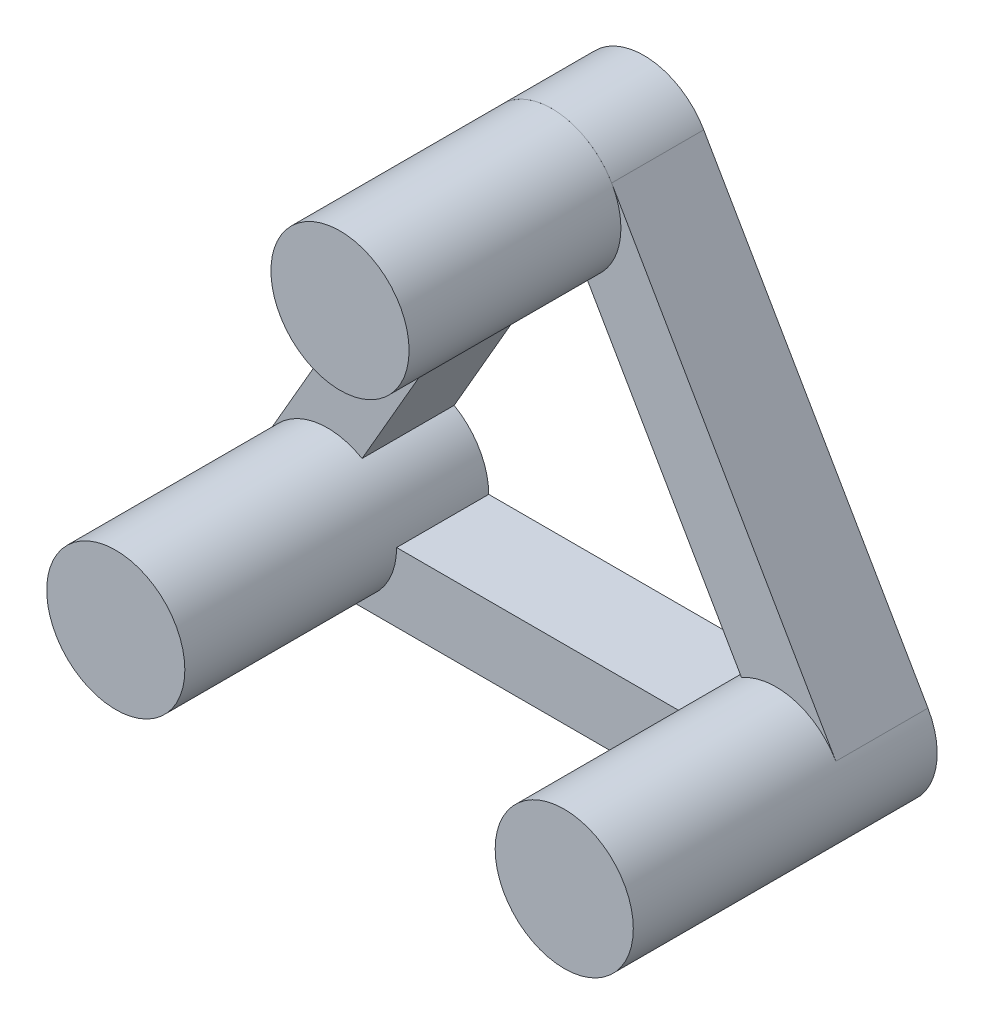
ISO-10303-21;
HEADER;
FILE_DESCRIPTION(('STEP AP214'),'2;1');
FILE_NAME('part.step','',(''),(''),'','','');
FILE_SCHEMA(('AUTOMOTIVE_DESIGN { 1 0 10303 214 1 1 1 1 }'));
ENDSEC;
DATA;
#1=APPLICATION_CONTEXT('core data for automotive mechanical design processes');
#2=APPLICATION_PROTOCOL_DEFINITION('international standard','automotive_design',2000,#1);
#3=PRODUCT_CONTEXT('',#1,'mechanical');
#4=PRODUCT('Part','Part','',(#3));
#5=PRODUCT_RELATED_PRODUCT_CATEGORY('part','',(#4));
#6=PRODUCT_DEFINITION_FORMATION('','',#4);
#7=PRODUCT_DEFINITION_CONTEXT('part definition',#1,'design');
#8=PRODUCT_DEFINITION('design','',#6,#7);
#9=PRODUCT_DEFINITION_SHAPE('','',#8);
#10=(LENGTH_UNIT() NAMED_UNIT(*) SI_UNIT(.MILLI.,.METRE.));
#11=(NAMED_UNIT(*) PLANE_ANGLE_UNIT() SI_UNIT($,.RADIAN.));
#12=(NAMED_UNIT(*) SI_UNIT($,.STERADIAN.) SOLID_ANGLE_UNIT());
#13=UNCERTAINTY_MEASURE_WITH_UNIT(LENGTH_MEASURE(1.E-05),#10,'distance_accuracy_value','');
#14=(GEOMETRIC_REPRESENTATION_CONTEXT(3) GLOBAL_UNCERTAINTY_ASSIGNED_CONTEXT((#13)) GLOBAL_UNIT_ASSIGNED_CONTEXT((#10,
#11,#12)) REPRESENTATION_CONTEXT('',''));
#15=CARTESIAN_POINT('',(0.,0.,0.));
#16=DIRECTION('',(0.,0.,1.));
#17=DIRECTION('',(1.,0.,0.));
#18=AXIS2_PLACEMENT_3D('',#15,#16,#17);
#19=CARTESIAN_POINT('',(0.05,5.62424217766403,2.));
#20=DIRECTION('',(0.,0.,1.));
#21=DIRECTION('',(1.,0.,0.));
#22=AXIS2_PLACEMENT_3D('',#19,#20,#21);
#23=PLANE('',#22);
#24=CARTESIAN_POINT('',(0.05,5.62424217766403,2.));
#25=DIRECTION('',(0.,0.,1.));
#26=DIRECTION('',(1.,0.,0.));
#27=AXIS2_PLACEMENT_3D('',#24,#25,#26);
#28=CIRCLE('',#27,1.5);
#29=CARTESIAN_POINT('',(1.55,5.62424217766403,2.));
#30=VERTEX_POINT('',#29);
#31=EDGE_CURVE('E11',#30,#30,#28,.T.);
#32=ORIENTED_EDGE('',*,*,#31,.F.);
#33=EDGE_LOOP('',(#32));
#34=FACE_BOUND('',#33,.T.);
#35=CARTESIAN_POINT('',(4.92,-2.81730165195254,2.));
#36=DIRECTION('',(0.,0.,1.));
#37=DIRECTION('',(1.,0.,0.));
#38=AXIS2_PLACEMENT_3D('',#35,#36,#37);
#39=CIRCLE('',#38,1.5);
#40=CARTESIAN_POINT('',(6.21930986066976,-2.06777254246691,2.));
#41=VERTEX_POINT('',#40);
#42=CARTESIAN_POINT('',(4.17043034366014,-1.51801518227214,2.));
#43=VERTEX_POINT('',#42);
#44=EDGE_CURVE('E243',#41,#43,#39,.T.);
#45=ORIENTED_EDGE('',*,*,#44,.F.);
#46=DIRECTION('',(-0.499686072990422,0.866206573779841,0.));
#47=VECTOR('',#46,1.);
#48=CARTESIAN_POINT('',(1.34957329843808,6.37392325573073,2.));
#49=LINE('',#48,#47);
#50=CARTESIAN_POINT('',(1.34957329843808,6.37392325573073,2.));
#51=VERTEX_POINT('',#50);
#52=EDGE_CURVE('E202',#41,#51,#49,.T.);
#53=ORIENTED_EDGE('',*,*,#52,.T.);
#54=CARTESIAN_POINT('',(0.05,5.62424217766403,2.));
#55=DIRECTION('',(0.,0.,1.));
#56=DIRECTION('',(1.,0.,0.));
#57=AXIS2_PLACEMENT_3D('',#54,#55,#56);
#58=CIRCLE('',#57,1.50030412811019);
#59=CARTESIAN_POINT('',(-1.24957329843808,6.37392325573073,2.));
#60=VERTEX_POINT('',#59);
#61=EDGE_CURVE('E194',#51,#60,#58,.T.);
#62=ORIENTED_EDGE('',*,*,#61,.T.);
#63=DIRECTION('',(-0.499686072990422,-0.866206573779841,0.));
#64=VECTOR('',#63,1.);
#65=CARTESIAN_POINT('',(-1.24957329843808,6.37392325573073,2.));
#66=LINE('',#65,#64);
#67=CARTESIAN_POINT('',(-6.11930986066976,-2.06777254246691,2.));
#68=VERTEX_POINT('',#67);
#69=EDGE_CURVE('E197',#60,#68,#66,.T.);
#70=ORIENTED_EDGE('',*,*,#69,.T.);
#71=CARTESIAN_POINT('',(-4.82,-2.81730165195254,2.));
#72=DIRECTION('',(0.,0.,1.));
#73=DIRECTION('',(1.,0.,0.));
#74=AXIS2_PLACEMENT_3D('',#71,#72,#73);
#75=CIRCLE('',#74,1.5);
#76=CARTESIAN_POINT('',(-4.07043034366014,-1.51801518227214,2.));
#77=VERTEX_POINT('',#76);
#78=EDGE_CURVE('E155',#77,#68,#75,.T.);
#79=ORIENTED_EDGE('',*,*,#78,.F.);
#80=DIRECTION('',(-0.499713104226571,-0.866190979786931,0.));
#81=VECTOR('',#80,1.);
#82=CARTESIAN_POINT('',(-0.699721633141885,4.32469227495788,2.));
#83=LINE('',#82,#81);
#84=CARTESIAN_POINT('',(-0.699721633141885,4.32469227495788,2.));
#85=VERTEX_POINT('',#84);
#86=EDGE_CURVE('E170',#85,#77,#83,.T.);
#87=ORIENTED_EDGE('',*,*,#86,.F.);
#88=CARTESIAN_POINT('',(0.05,5.62424217766403,2.));
#89=DIRECTION('',(0.,0.,-1.));
#90=DIRECTION('',(1.,0.,0.));
#91=AXIS2_PLACEMENT_3D('',#88,#89,#90);
#92=CIRCLE('',#91,1.50030412811019);
#93=CARTESIAN_POINT('',(0.799721633141884,4.32469227495788,2.));
#94=VERTEX_POINT('',#93);
#95=EDGE_CURVE('E168',#94,#85,#92,.T.);
#96=ORIENTED_EDGE('',*,*,#95,.F.);
#97=DIRECTION('',(-0.499713104226572,0.866190979786931,0.));
#98=VECTOR('',#97,1.);
#99=CARTESIAN_POINT('',(4.17043034366014,-1.51801518227214,2.));
#100=LINE('',#99,#98);
#101=EDGE_CURVE('E140',#43,#94,#100,.T.);
#102=ORIENTED_EDGE('',*,*,#101,.F.);
#103=EDGE_LOOP('',(#45,#53,#62,#70,#79,#87,#96,#102));
#104=FACE_BOUND('',#103,.T.);
#105=ADVANCED_FACE('F38',(#34,#104),#23,.T.);
#106=CARTESIAN_POINT('',(3.42,-2.81730165195254,2.));
#107=VERTEX_POINT('',#106);
#108=CARTESIAN_POINT('',(4.92,-4.31730165195254,2.));
#109=VERTEX_POINT('',#108);
#110=EDGE_CURVE('E47',#107,#109,#39,.T.);
#111=ORIENTED_EDGE('',*,*,#110,.F.);
#112=DIRECTION('',(1.,0.,0.));
#113=VECTOR('',#112,1.);
#114=CARTESIAN_POINT('',(-3.32,-2.81730165195254,2.));
#115=LINE('',#114,#113);
#116=CARTESIAN_POINT('',(-3.32,-2.81730165195254,2.));
#117=VERTEX_POINT('',#116);
#118=EDGE_CURVE('E131',#117,#107,#115,.T.);
#119=ORIENTED_EDGE('',*,*,#118,.F.);
#120=CARTESIAN_POINT('',(-4.82,-4.31730165195254,2.));
#121=VERTEX_POINT('',#120);
#122=EDGE_CURVE('E135',#121,#117,#75,.T.);
#123=ORIENTED_EDGE('',*,*,#122,.F.);
#124=DIRECTION('',(1.,0.,0.));
#125=VECTOR('',#124,1.);
#126=CARTESIAN_POINT('',(-4.82,-4.31730165195254,2.));
#127=LINE('',#126,#125);
#128=EDGE_CURVE('E200',#121,#109,#127,.T.);
#129=ORIENTED_EDGE('',*,*,#128,.T.);
#130=EDGE_LOOP('',(#111,#119,#123,#129));
#131=FACE_BOUND('',#130,.T.);
#132=ADVANCED_FACE('F133',(#131),#23,.T.);
#133=CARTESIAN_POINT('',(0.05,5.62424217766403,0.));
#134=DIRECTION('',(0.,0.,1.));
#135=DIRECTION('',(1.,0.,0.));
#136=AXIS2_PLACEMENT_3D('',#133,#134,#135);
#137=PLANE('',#136);
#138=CARTESIAN_POINT('',(0.05,5.62424217766403,0.));
#139=DIRECTION('',(0.,0.,1.));
#140=DIRECTION('',(1.,0.,0.));
#141=AXIS2_PLACEMENT_3D('',#138,#139,#140);
#142=CIRCLE('',#141,1.50030412811019);
#143=CARTESIAN_POINT('',(1.34957329843808,6.37392325573073,0.));
#144=VERTEX_POINT('',#143);
#145=CARTESIAN_POINT('',(-1.24957329843808,6.37392325573073,0.));
#146=VERTEX_POINT('',#145);
#147=EDGE_CURVE('E147',#144,#146,#142,.T.);
#148=ORIENTED_EDGE('',*,*,#147,.F.);
#149=DIRECTION('',(-0.499686072990422,0.866206573779841,0.));
#150=VECTOR('',#149,1.);
#151=CARTESIAN_POINT('',(1.34957329843808,6.37392325573073,0.));
#152=LINE('',#151,#150);
#153=CARTESIAN_POINT('',(6.21930986066976,-2.06777254246691,0.));
#154=VERTEX_POINT('',#153);
#155=EDGE_CURVE('E198',#154,#144,#152,.T.);
#156=ORIENTED_EDGE('',*,*,#155,.F.);
#157=CARTESIAN_POINT('',(4.92,-2.81730165195254,0.));
#158=DIRECTION('',(0.,0.,1.));
#159=DIRECTION('',(1.,0.,0.));
#160=AXIS2_PLACEMENT_3D('',#157,#158,#159);
#161=CIRCLE('',#160,1.5);
#162=CARTESIAN_POINT('',(4.92,-4.31730165195254,0.));
#163=VERTEX_POINT('',#162);
#164=EDGE_CURVE('E213',#163,#154,#161,.T.);
#165=ORIENTED_EDGE('',*,*,#164,.F.);
#166=DIRECTION('',(1.,0.,0.));
#167=VECTOR('',#166,1.);
#168=CARTESIAN_POINT('',(-4.82,-4.31730165195254,0.));
#169=LINE('',#168,#167);
#170=CARTESIAN_POINT('',(-4.82,-4.31730165195254,0.));
#171=VERTEX_POINT('',#170);
#172=EDGE_CURVE('E211',#171,#163,#169,.T.);
#173=ORIENTED_EDGE('',*,*,#172,.F.);
#174=CARTESIAN_POINT('',(-4.82,-2.81730165195254,0.));
#175=DIRECTION('',(0.,0.,1.));
#176=DIRECTION('',(1.,0.,0.));
#177=AXIS2_PLACEMENT_3D('',#174,#175,#176);
#178=CIRCLE('',#177,1.5);
#179=CARTESIAN_POINT('',(-6.11930986066976,-2.06777254246691,0.));
#180=VERTEX_POINT('',#179);
#181=EDGE_CURVE('E209',#180,#171,#178,.T.);
#182=ORIENTED_EDGE('',*,*,#181,.F.);
#183=DIRECTION('',(-0.499686072990422,-0.866206573779841,0.));
#184=VECTOR('',#183,1.);
#185=CARTESIAN_POINT('',(-1.24957329843808,6.37392325573073,0.));
#186=LINE('',#185,#184);
#187=EDGE_CURVE('E207',#146,#180,#186,.T.);
#188=ORIENTED_EDGE('',*,*,#187,.F.);
#189=EDGE_LOOP('',(#148,#156,#165,#173,#182,#188));
#190=FACE_BOUND('',#189,.T.);
#191=CARTESIAN_POINT('',(-4.82,-2.81730165195254,0.));
#192=DIRECTION('',(0.,0.,-1.));
#193=DIRECTION('',(1.,0.,0.));
#194=AXIS2_PLACEMENT_3D('',#191,#192,#193);
#195=CIRCLE('',#194,1.5);
#196=CARTESIAN_POINT('',(-4.07043034366014,-1.51801518227214,0.));
#197=VERTEX_POINT('',#196);
#198=CARTESIAN_POINT('',(-3.32,-2.81730165195254,0.));
#199=VERTEX_POINT('',#198);
#200=EDGE_CURVE('E63',#197,#199,#195,.T.);
#201=ORIENTED_EDGE('',*,*,#200,.T.);
#202=DIRECTION('',(1.,0.,0.));
#203=VECTOR('',#202,1.);
#204=CARTESIAN_POINT('',(-3.32,-2.81730165195254,0.));
#205=LINE('',#204,#203);
#206=CARTESIAN_POINT('',(3.42,-2.81730165195254,0.));
#207=VERTEX_POINT('',#206);
#208=EDGE_CURVE('E146',#199,#207,#205,.T.);
#209=ORIENTED_EDGE('',*,*,#208,.T.);
#210=CARTESIAN_POINT('',(4.92,-2.81730165195254,0.));
#211=DIRECTION('',(0.,0.,-1.));
#212=DIRECTION('',(1.,0.,0.));
#213=AXIS2_PLACEMENT_3D('',#210,#211,#212);
#214=CIRCLE('',#213,1.5);
#215=CARTESIAN_POINT('',(4.17043034366014,-1.51801518227214,0.));
#216=VERTEX_POINT('',#215);
#217=EDGE_CURVE('E176',#207,#216,#214,.T.);
#218=ORIENTED_EDGE('',*,*,#217,.T.);
#219=DIRECTION('',(-0.499713104226572,0.866190979786931,0.));
#220=VECTOR('',#219,1.);
#221=CARTESIAN_POINT('',(4.17043034366014,-1.51801518227214,0.));
#222=LINE('',#221,#220);
#223=CARTESIAN_POINT('',(0.799721633141884,4.32469227495788,0.));
#224=VERTEX_POINT('',#223);
#225=EDGE_CURVE('E179',#216,#224,#222,.T.);
#226=ORIENTED_EDGE('',*,*,#225,.T.);
#227=CARTESIAN_POINT('',(0.05,5.62424217766403,0.));
#228=DIRECTION('',(0.,0.,-1.));
#229=DIRECTION('',(1.,0.,0.));
#230=AXIS2_PLACEMENT_3D('',#227,#228,#229);
#231=CIRCLE('',#230,1.50030412811019);
#232=CARTESIAN_POINT('',(-0.699721633141885,4.32469227495788,0.));
#233=VERTEX_POINT('',#232);
#234=EDGE_CURVE('E182',#224,#233,#231,.T.);
#235=ORIENTED_EDGE('',*,*,#234,.T.);
#236=DIRECTION('',(-0.499713104226571,-0.866190979786931,0.));
#237=VECTOR('',#236,1.);
#238=CARTESIAN_POINT('',(-0.699721633141885,4.32469227495788,0.));
#239=LINE('',#238,#237);
#240=EDGE_CURVE('E141',#233,#197,#239,.T.);
#241=ORIENTED_EDGE('',*,*,#240,.T.);
#242=EDGE_LOOP('',(#201,#209,#218,#226,#235,#241));
#243=FACE_BOUND('',#242,.T.);
#244=ADVANCED_FACE('F231',(#190,#243),#137,.F.);
#245=CARTESIAN_POINT('',(0.05,5.62424217766403,2.));
#246=DIRECTION('',(0.,0.,-1.));
#247=DIRECTION('',(-1.,0.,0.));
#248=AXIS2_PLACEMENT_3D('',#245,#246,#247);
#249=CYLINDRICAL_SURFACE('',#248,1.50030412811019);
#250=ORIENTED_EDGE('',*,*,#147,.T.);
#251=DIRECTION('',(0.,0.,-1.));
#252=VECTOR('',#251,1.);
#253=CARTESIAN_POINT('',(-1.24957329843808,6.37392325573073,2.));
#254=LINE('',#253,#252);
#255=EDGE_CURVE('E42',#60,#146,#254,.T.);
#256=ORIENTED_EDGE('',*,*,#255,.F.);
#257=ORIENTED_EDGE('',*,*,#61,.F.);
#258=DIRECTION('',(0.,0.,-1.));
#259=VECTOR('',#258,1.);
#260=CARTESIAN_POINT('',(1.34957329843808,6.37392325573073,2.));
#261=LINE('',#260,#259);
#262=EDGE_CURVE('E204',#51,#144,#261,.T.);
#263=ORIENTED_EDGE('',*,*,#262,.T.);
#264=EDGE_LOOP('',(#250,#256,#257,#263));
#265=FACE_BOUND('',#264,.T.);
#266=ADVANCED_FACE('F40',(#265),#249,.T.);
#267=CARTESIAN_POINT('',(-1.24957329843808,6.37392325573073,2.));
#268=DIRECTION('',(0.866206573779841,-0.499686072990422,0.));
#269=DIRECTION('',(0.499686072990422,0.866206573779841,0.));
#270=AXIS2_PLACEMENT_3D('',#267,#268,#269);
#271=PLANE('',#270);
#272=ORIENTED_EDGE('',*,*,#187,.T.);
#273=DIRECTION('',(0.,0.,-1.));
#274=VECTOR('',#273,1.);
#275=CARTESIAN_POINT('',(-6.11930986066976,-2.06777254246691,2.));
#276=LINE('',#275,#274);
#277=EDGE_CURVE('E159',#68,#180,#276,.T.);
#278=ORIENTED_EDGE('',*,*,#277,.F.);
#279=ORIENTED_EDGE('',*,*,#69,.F.);
#280=ORIENTED_EDGE('',*,*,#255,.T.);
#281=EDGE_LOOP('',(#272,#278,#279,#280));
#282=FACE_BOUND('',#281,.T.);
#283=ADVANCED_FACE('F279',(#282),#271,.F.);
#284=CARTESIAN_POINT('',(-4.82,-2.81730165195254,2.));
#285=DIRECTION('',(0.,0.,-1.));
#286=DIRECTION('',(-1.,0.,0.));
#287=AXIS2_PLACEMENT_3D('',#284,#285,#286);
#288=CYLINDRICAL_SURFACE('',#287,1.5);
#289=ORIENTED_EDGE('',*,*,#181,.T.);
#290=DIRECTION('',(0.,0.,-1.));
#291=VECTOR('',#290,1.);
#292=CARTESIAN_POINT('',(-4.82,-4.31730165195254,2.));
#293=LINE('',#292,#291);
#294=EDGE_CURVE('E153',#121,#171,#293,.T.);
#295=ORIENTED_EDGE('',*,*,#294,.F.);
#296=ORIENTED_EDGE('',*,*,#122,.T.);
#297=DIRECTION('',(0.,0.,-1.));
#298=VECTOR('',#297,1.);
#299=CARTESIAN_POINT('',(-3.32,-2.81730165195254,2.));
#300=LINE('',#299,#298);
#301=EDGE_CURVE('E143',#117,#199,#300,.T.);
#302=ORIENTED_EDGE('',*,*,#301,.T.);
#303=ORIENTED_EDGE('',*,*,#200,.F.);
#304=DIRECTION('',(0.,0.,-1.));
#305=VECTOR('',#304,1.);
#306=CARTESIAN_POINT('',(-4.07043034366014,-1.51801518227214,2.));
#307=LINE('',#306,#305);
#308=EDGE_CURVE('E172',#77,#197,#307,.T.);
#309=ORIENTED_EDGE('',*,*,#308,.F.);
#310=ORIENTED_EDGE('',*,*,#78,.T.);
#311=ORIENTED_EDGE('',*,*,#277,.T.);
#312=EDGE_LOOP('',(#289,#295,#296,#302,#303,#309,#310,#311));
#313=FACE_BOUND('',#312,.T.);
#314=CARTESIAN_POINT('',(-4.82,-2.81730165195254,6.6));
#315=DIRECTION('',(0.,0.,1.));
#316=DIRECTION('',(1.,0.,0.));
#317=AXIS2_PLACEMENT_3D('',#314,#315,#316);
#318=CIRCLE('',#317,1.5);
#319=CARTESIAN_POINT('',(-3.32,-2.81730165195254,6.6));
#320=VERTEX_POINT('',#319);
#321=EDGE_CURVE('E164',#320,#320,#318,.T.);
#322=ORIENTED_EDGE('',*,*,#321,.F.);
#323=EDGE_LOOP('',(#322));
#324=FACE_BOUND('',#323,.T.);
#325=ADVANCED_FACE('F150',(#313,#324),#288,.T.);
#326=CARTESIAN_POINT('',(-4.82,-4.31730165195254,2.));
#327=DIRECTION('',(0.,1.,0.));
#328=DIRECTION('',(-1.,0.,0.));
#329=AXIS2_PLACEMENT_3D('',#326,#327,#328);
#330=PLANE('',#329);
#331=ORIENTED_EDGE('',*,*,#172,.T.);
#332=DIRECTION('',(0.,0.,-1.));
#333=VECTOR('',#332,1.);
#334=CARTESIAN_POINT('',(4.92,-4.31730165195254,2.));
#335=LINE('',#334,#333);
#336=EDGE_CURVE('E221',#109,#163,#335,.T.);
#337=ORIENTED_EDGE('',*,*,#336,.F.);
#338=ORIENTED_EDGE('',*,*,#128,.F.);
#339=ORIENTED_EDGE('',*,*,#294,.T.);
#340=EDGE_LOOP('',(#331,#337,#338,#339));
#341=FACE_BOUND('',#340,.T.);
#342=ADVANCED_FACE('F237',(#341),#330,.F.);
#343=CARTESIAN_POINT('',(4.92,-2.81730165195254,2.));
#344=DIRECTION('',(0.,0.,-1.));
#345=DIRECTION('',(-1.,0.,0.));
#346=AXIS2_PLACEMENT_3D('',#343,#344,#345);
#347=CYLINDRICAL_SURFACE('',#346,1.5);
#348=ORIENTED_EDGE('',*,*,#164,.T.);
#349=DIRECTION('',(0.,0.,-1.));
#350=VECTOR('',#349,1.);
#351=CARTESIAN_POINT('',(6.21930986066976,-2.06777254246691,2.));
#352=LINE('',#351,#350);
#353=EDGE_CURVE('E218',#41,#154,#352,.T.);
#354=ORIENTED_EDGE('',*,*,#353,.F.);
#355=ORIENTED_EDGE('',*,*,#44,.T.);
#356=DIRECTION('',(0.,0.,-1.));
#357=VECTOR('',#356,1.);
#358=CARTESIAN_POINT('',(4.17043034366014,-1.51801518227214,2.));
#359=LINE('',#358,#357);
#360=EDGE_CURVE('E191',#43,#216,#359,.T.);
#361=ORIENTED_EDGE('',*,*,#360,.T.);
#362=ORIENTED_EDGE('',*,*,#217,.F.);
#363=DIRECTION('',(0.,0.,-1.));
#364=VECTOR('',#363,1.);
#365=CARTESIAN_POINT('',(3.42,-2.81730165195254,2.));
#366=LINE('',#365,#364);
#367=EDGE_CURVE('E148',#107,#207,#366,.T.);
#368=ORIENTED_EDGE('',*,*,#367,.F.);
#369=ORIENTED_EDGE('',*,*,#110,.T.);
#370=ORIENTED_EDGE('',*,*,#336,.T.);
#371=EDGE_LOOP('',(#348,#354,#355,#361,#362,#368,#369,#370));
#372=FACE_BOUND('',#371,.T.);
#373=CARTESIAN_POINT('',(4.92,-2.81730165195254,6.6));
#374=DIRECTION('',(0.,0.,1.));
#375=DIRECTION('',(1.,0.,0.));
#376=AXIS2_PLACEMENT_3D('',#373,#374,#375);
#377=CIRCLE('',#376,1.5);
#378=CARTESIAN_POINT('',(6.42,-2.81730165195254,6.6));
#379=VERTEX_POINT('',#378);
#380=EDGE_CURVE('E162',#379,#379,#377,.T.);
#381=ORIENTED_EDGE('',*,*,#380,.F.);
#382=EDGE_LOOP('',(#381));
#383=FACE_BOUND('',#382,.T.);
#384=ADVANCED_FACE('F239',(#372,#383),#347,.T.);
#385=CARTESIAN_POINT('',(1.34957329843808,6.37392325573073,2.));
#386=DIRECTION('',(-0.866206573779841,-0.499686072990422,0.));
#387=DIRECTION('',(0.499686072990422,-0.866206573779841,0.));
#388=AXIS2_PLACEMENT_3D('',#385,#386,#387);
#389=PLANE('',#388);
#390=ORIENTED_EDGE('',*,*,#155,.T.);
#391=ORIENTED_EDGE('',*,*,#262,.F.);
#392=ORIENTED_EDGE('',*,*,#52,.F.);
#393=ORIENTED_EDGE('',*,*,#353,.T.);
#394=EDGE_LOOP('',(#390,#391,#392,#393));
#395=FACE_BOUND('',#394,.T.);
#396=ADVANCED_FACE('F253',(#395),#389,.F.);
#397=CARTESIAN_POINT('',(-3.32,-2.81730165195254,2.));
#398=DIRECTION('',(0.,1.,0.));
#399=DIRECTION('',(-1.,0.,0.));
#400=AXIS2_PLACEMENT_3D('',#397,#398,#399);
#401=PLANE('',#400);
#402=ORIENTED_EDGE('',*,*,#208,.F.);
#403=ORIENTED_EDGE('',*,*,#301,.F.);
#404=ORIENTED_EDGE('',*,*,#118,.T.);
#405=ORIENTED_EDGE('',*,*,#367,.T.);
#406=EDGE_LOOP('',(#402,#403,#404,#405));
#407=FACE_BOUND('',#406,.T.);
#408=ADVANCED_FACE('F144',(#407),#401,.T.);
#409=CARTESIAN_POINT('',(4.17043034366014,-1.51801518227214,2.));
#410=DIRECTION('',(-0.866190979786931,-0.499713104226572,0.));
#411=DIRECTION('',(0.499713104226572,-0.866190979786931,0.));
#412=AXIS2_PLACEMENT_3D('',#409,#410,#411);
#413=PLANE('',#412);
#414=ORIENTED_EDGE('',*,*,#225,.F.);
#415=ORIENTED_EDGE('',*,*,#360,.F.);
#416=ORIENTED_EDGE('',*,*,#101,.T.);
#417=DIRECTION('',(0.,0.,-1.));
#418=VECTOR('',#417,1.);
#419=CARTESIAN_POINT('',(0.799721633141884,4.32469227495788,2.));
#420=LINE('',#419,#418);
#421=EDGE_CURVE('E189',#94,#224,#420,.T.);
#422=ORIENTED_EDGE('',*,*,#421,.T.);
#423=EDGE_LOOP('',(#414,#415,#416,#422));
#424=FACE_BOUND('',#423,.T.);
#425=ADVANCED_FACE('F293',(#424),#413,.T.);
#426=CARTESIAN_POINT('',(0.05,5.62424217766403,2.));
#427=DIRECTION('',(0.,0.,-1.));
#428=DIRECTION('',(-1.,0.,0.));
#429=AXIS2_PLACEMENT_3D('',#426,#427,#428);
#430=CYLINDRICAL_SURFACE('',#429,1.50030412811019);
#431=ORIENTED_EDGE('',*,*,#234,.F.);
#432=ORIENTED_EDGE('',*,*,#421,.F.);
#433=ORIENTED_EDGE('',*,*,#95,.T.);
#434=DIRECTION('',(0.,0.,-1.));
#435=VECTOR('',#434,1.);
#436=CARTESIAN_POINT('',(-0.699721633141885,4.32469227495788,2.));
#437=LINE('',#436,#435);
#438=EDGE_CURVE('E55',#85,#233,#437,.T.);
#439=ORIENTED_EDGE('',*,*,#438,.T.);
#440=EDGE_LOOP('',(#431,#432,#433,#439));
#441=FACE_BOUND('',#440,.T.);
#442=ADVANCED_FACE('F296',(#441),#430,.T.);
#443=CARTESIAN_POINT('',(-0.699721633141885,4.32469227495788,2.));
#444=DIRECTION('',(0.866190979786931,-0.499713104226571,0.));
#445=DIRECTION('',(0.499713104226571,0.866190979786931,0.));
#446=AXIS2_PLACEMENT_3D('',#443,#444,#445);
#447=PLANE('',#446);
#448=ORIENTED_EDGE('',*,*,#240,.F.);
#449=ORIENTED_EDGE('',*,*,#438,.F.);
#450=ORIENTED_EDGE('',*,*,#86,.T.);
#451=ORIENTED_EDGE('',*,*,#308,.T.);
#452=EDGE_LOOP('',(#448,#449,#450,#451));
#453=FACE_BOUND('',#452,.T.);
#454=ADVANCED_FACE('F297',(#453),#447,.T.);
#455=CARTESIAN_POINT('',(-4.82,-2.81730165195254,6.6));
#456=DIRECTION('',(0.,0.,1.));
#457=DIRECTION('',(1.,0.,0.));
#458=AXIS2_PLACEMENT_3D('',#455,#456,#457);
#459=PLANE('',#458);
#460=ORIENTED_EDGE('',*,*,#321,.T.);
#461=EDGE_LOOP('',(#460));
#462=FACE_BOUND('',#461,.T.);
#463=ADVANCED_FACE('F299',(#462),#459,.T.);
#464=CARTESIAN_POINT('',(4.92,-2.81730165195254,6.6));
#465=DIRECTION('',(0.,0.,1.));
#466=DIRECTION('',(1.,0.,0.));
#467=AXIS2_PLACEMENT_3D('',#464,#465,#466);
#468=PLANE('',#467);
#469=ORIENTED_EDGE('',*,*,#380,.T.);
#470=EDGE_LOOP('',(#469));
#471=FACE_BOUND('',#470,.T.);
#472=ADVANCED_FACE('F251',(#471),#468,.T.);
#473=CARTESIAN_POINT('',(0.05,5.62424217766403,6.6));
#474=DIRECTION('',(0.,0.,-1.));
#475=DIRECTION('',(-1.,0.,0.));
#476=AXIS2_PLACEMENT_3D('',#473,#474,#475);
#477=CYLINDRICAL_SURFACE('',#476,1.5);
#478=CARTESIAN_POINT('',(0.05,5.62424217766403,6.6));
#479=DIRECTION('',(0.,0.,1.));
#480=DIRECTION('',(1.,0.,0.));
#481=AXIS2_PLACEMENT_3D('',#478,#479,#480);
#482=CIRCLE('',#481,1.5);
#483=CARTESIAN_POINT('',(1.55,5.62424217766403,6.6));
#484=VERTEX_POINT('',#483);
#485=EDGE_CURVE('E174',#484,#484,#482,.T.);
#486=ORIENTED_EDGE('',*,*,#485,.F.);
#487=EDGE_LOOP('',(#486));
#488=FACE_BOUND('',#487,.T.);
#489=ORIENTED_EDGE('',*,*,#31,.T.);
#490=EDGE_LOOP('',(#489));
#491=FACE_BOUND('',#490,.T.);
#492=ADVANCED_FACE('F374',(#488,#491),#477,.T.);
#493=CARTESIAN_POINT('',(0.05,5.62424217766403,6.6));
#494=DIRECTION('',(0.,0.,1.));
#495=DIRECTION('',(1.,0.,0.));
#496=AXIS2_PLACEMENT_3D('',#493,#494,#495);
#497=PLANE('',#496);
#498=ORIENTED_EDGE('',*,*,#485,.T.);
#499=EDGE_LOOP('',(#498));
#500=FACE_BOUND('',#499,.T.);
#501=ADVANCED_FACE('F382',(#500),#497,.T.);
#502=CLOSED_SHELL('',(#105,#132,#244,#266,#283,#325,#342,#384,#396,#408,#425,#442,#454,#463,
#472,#492,#501));
#503=MANIFOLD_SOLID_BREP('B2',#502);
#504=ADVANCED_BREP_SHAPE_REPRESENTATION('',(#18,#503),#14);
#505=SHAPE_DEFINITION_REPRESENTATION(#9,#504);
ENDSEC;
END-ISO-10303-21;
